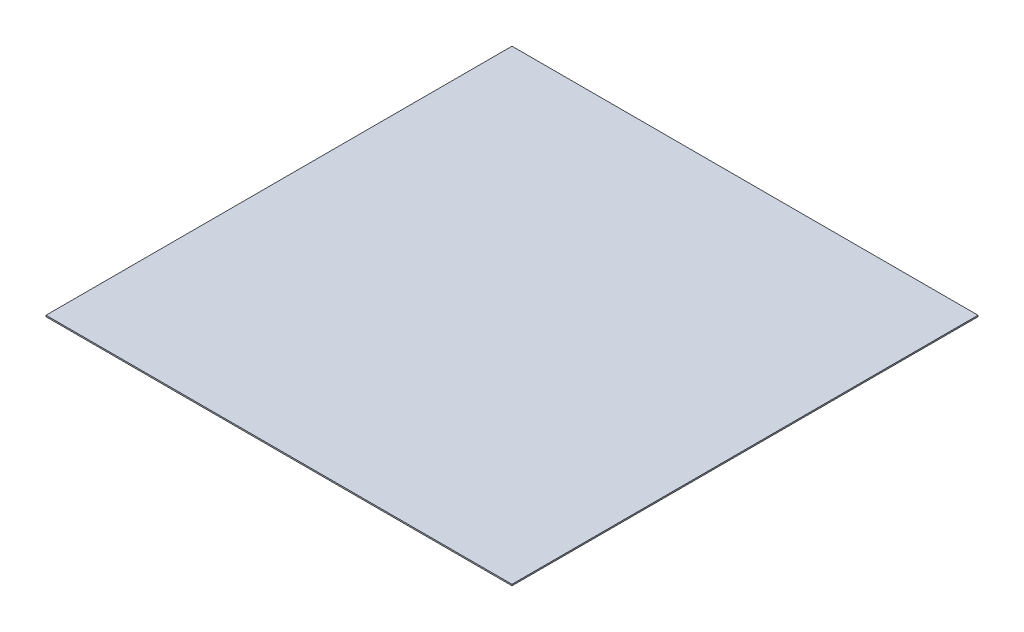
ISO-10303-21;
HEADER;
FILE_DESCRIPTION(('STEP AP214'),'2;1');
FILE_NAME('part.step','',(''),(''),'','','');
FILE_SCHEMA(('AUTOMOTIVE_DESIGN { 1 0 10303 214 1 1 1 1 }'));
ENDSEC;
DATA;
#1=APPLICATION_CONTEXT('core data for automotive mechanical design processes');
#2=APPLICATION_PROTOCOL_DEFINITION('international standard','automotive_design',2000,#1);
#3=PRODUCT_CONTEXT('',#1,'mechanical');
#4=PRODUCT('Part','Part','',(#3));
#5=PRODUCT_RELATED_PRODUCT_CATEGORY('part','',(#4));
#6=PRODUCT_DEFINITION_FORMATION('','',#4);
#7=PRODUCT_DEFINITION_CONTEXT('part definition',#1,'design');
#8=PRODUCT_DEFINITION('design','',#6,#7);
#9=PRODUCT_DEFINITION_SHAPE('','',#8);
#10=(LENGTH_UNIT() NAMED_UNIT(*) SI_UNIT(.MILLI.,.METRE.));
#11=(NAMED_UNIT(*) PLANE_ANGLE_UNIT() SI_UNIT($,.RADIAN.));
#12=(NAMED_UNIT(*) SI_UNIT($,.STERADIAN.) SOLID_ANGLE_UNIT());
#13=UNCERTAINTY_MEASURE_WITH_UNIT(LENGTH_MEASURE(1.E-05),#10,'distance_accuracy_value','');
#14=(GEOMETRIC_REPRESENTATION_CONTEXT(3) GLOBAL_UNCERTAINTY_ASSIGNED_CONTEXT((#13)) GLOBAL_UNIT_ASSIGNED_CONTEXT((#10,
#11,#12)) REPRESENTATION_CONTEXT('',''));
#15=CARTESIAN_POINT('',(0.,0.,0.));
#16=DIRECTION('',(0.,0.,1.));
#17=DIRECTION('',(1.,0.,0.));
#18=AXIS2_PLACEMENT_3D('',#15,#16,#17);
#19=CARTESIAN_POINT('',(0.,1.,345.));
#20=DIRECTION('',(0.,0.,-1.));
#21=DIRECTION('',(-1.,0.,0.));
#22=AXIS2_PLACEMENT_3D('',#19,#20,#21);
#23=PLANE('',#22);
#24=DIRECTION('',(1.,0.,0.));
#25=VECTOR('',#24,1.);
#26=CARTESIAN_POINT('',(0.,0.,345.));
#27=LINE('',#26,#25);
#28=CARTESIAN_POINT('',(0.,0.,345.));
#29=VERTEX_POINT('',#28);
#30=CARTESIAN_POINT('',(345.,0.,345.));
#31=VERTEX_POINT('',#30);
#32=EDGE_CURVE('E101',#29,#31,#27,.T.);
#33=ORIENTED_EDGE('',*,*,#32,.T.);
#34=DIRECTION('',(0.,-1.,0.));
#35=VECTOR('',#34,1.);
#36=CARTESIAN_POINT('',(345.,1.,345.));
#37=LINE('',#36,#35);
#38=CARTESIAN_POINT('',(345.,1.,345.));
#39=VERTEX_POINT('',#38);
#40=EDGE_CURVE('E11',#39,#31,#37,.T.);
#41=ORIENTED_EDGE('',*,*,#40,.F.);
#42=DIRECTION('',(1.,0.,0.));
#43=VECTOR('',#42,1.);
#44=CARTESIAN_POINT('',(0.,1.,345.));
#45=LINE('',#44,#43);
#46=CARTESIAN_POINT('',(0.,1.,345.));
#47=VERTEX_POINT('',#46);
#48=EDGE_CURVE('E78',#47,#39,#45,.T.);
#49=ORIENTED_EDGE('',*,*,#48,.F.);
#50=DIRECTION('',(0.,-1.,0.));
#51=VECTOR('',#50,1.);
#52=CARTESIAN_POINT('',(0.,1.,345.));
#53=LINE('',#52,#51);
#54=EDGE_CURVE('E100',#47,#29,#53,.T.);
#55=ORIENTED_EDGE('',*,*,#54,.T.);
#56=EDGE_LOOP('',(#33,#41,#49,#55));
#57=FACE_BOUND('',#56,.T.);
#58=ADVANCED_FACE('F41',(#57),#23,.F.);
#59=CARTESIAN_POINT('',(345.,1.,0.));
#60=DIRECTION('',(1.,0.,0.));
#61=DIRECTION('',(0.,0.,-1.));
#62=AXIS2_PLACEMENT_3D('',#59,#60,#61);
#63=PLANE('',#62);
#64=DIRECTION('',(0.,0.,1.));
#65=VECTOR('',#64,1.);
#66=CARTESIAN_POINT('',(345.,0.,0.));
#67=LINE('',#66,#65);
#68=CARTESIAN_POINT('',(345.,0.,0.));
#69=VERTEX_POINT('',#68);
#70=EDGE_CURVE('E88',#69,#31,#67,.T.);
#71=ORIENTED_EDGE('',*,*,#70,.F.);
#72=DIRECTION('',(0.,-1.,0.));
#73=VECTOR('',#72,1.);
#74=CARTESIAN_POINT('',(345.,1.,0.));
#75=LINE('',#74,#73);
#76=CARTESIAN_POINT('',(345.,1.,0.));
#77=VERTEX_POINT('',#76);
#78=EDGE_CURVE('E47',#77,#69,#75,.T.);
#79=ORIENTED_EDGE('',*,*,#78,.F.);
#80=DIRECTION('',(0.,0.,1.));
#81=VECTOR('',#80,1.);
#82=CARTESIAN_POINT('',(345.,1.,0.));
#83=LINE('',#82,#81);
#84=EDGE_CURVE('E90',#77,#39,#83,.T.);
#85=ORIENTED_EDGE('',*,*,#84,.T.);
#86=ORIENTED_EDGE('',*,*,#40,.T.);
#87=EDGE_LOOP('',(#71,#79,#85,#86));
#88=FACE_BOUND('',#87,.T.);
#89=ADVANCED_FACE('F86',(#88),#63,.T.);
#90=CARTESIAN_POINT('',(0.,1.,0.));
#91=DIRECTION('',(0.,0.,-1.));
#92=DIRECTION('',(-1.,0.,0.));
#93=AXIS2_PLACEMENT_3D('',#90,#91,#92);
#94=PLANE('',#93);
#95=DIRECTION('',(1.,0.,0.));
#96=VECTOR('',#95,1.);
#97=CARTESIAN_POINT('',(0.,0.,0.));
#98=LINE('',#97,#96);
#99=CARTESIAN_POINT('',(0.,0.,0.));
#100=VERTEX_POINT('',#99);
#101=EDGE_CURVE('E110',#100,#69,#98,.T.);
#102=ORIENTED_EDGE('',*,*,#101,.F.);
#103=DIRECTION('',(0.,-1.,0.));
#104=VECTOR('',#103,1.);
#105=CARTESIAN_POINT('',(0.,1.,0.));
#106=LINE('',#105,#104);
#107=CARTESIAN_POINT('',(0.,1.,0.));
#108=VERTEX_POINT('',#107);
#109=EDGE_CURVE('E71',#108,#100,#106,.T.);
#110=ORIENTED_EDGE('',*,*,#109,.F.);
#111=DIRECTION('',(1.,0.,0.));
#112=VECTOR('',#111,1.);
#113=CARTESIAN_POINT('',(0.,1.,0.));
#114=LINE('',#113,#112);
#115=EDGE_CURVE('E92',#108,#77,#114,.T.);
#116=ORIENTED_EDGE('',*,*,#115,.T.);
#117=ORIENTED_EDGE('',*,*,#78,.T.);
#118=EDGE_LOOP('',(#102,#110,#116,#117));
#119=FACE_BOUND('',#118,.T.);
#120=ADVANCED_FACE('F97',(#119),#94,.T.);
#121=CARTESIAN_POINT('',(0.,1.,0.));
#122=DIRECTION('',(1.,0.,0.));
#123=DIRECTION('',(0.,0.,-1.));
#124=AXIS2_PLACEMENT_3D('',#121,#122,#123);
#125=PLANE('',#124);
#126=DIRECTION('',(0.,0.,1.));
#127=VECTOR('',#126,1.);
#128=CARTESIAN_POINT('',(0.,0.,0.));
#129=LINE('',#128,#127);
#130=EDGE_CURVE('E72',#100,#29,#129,.T.);
#131=ORIENTED_EDGE('',*,*,#130,.T.);
#132=ORIENTED_EDGE('',*,*,#54,.F.);
#133=DIRECTION('',(0.,0.,1.));
#134=VECTOR('',#133,1.);
#135=CARTESIAN_POINT('',(0.,1.,0.));
#136=LINE('',#135,#134);
#137=EDGE_CURVE('E60',#108,#47,#136,.T.);
#138=ORIENTED_EDGE('',*,*,#137,.F.);
#139=ORIENTED_EDGE('',*,*,#109,.T.);
#140=EDGE_LOOP('',(#131,#132,#138,#139));
#141=FACE_BOUND('',#140,.T.);
#142=ADVANCED_FACE('F119',(#141),#125,.F.);
#143=CARTESIAN_POINT('',(0.,1.,0.));
#144=DIRECTION('',(0.,-1.,0.));
#145=DIRECTION('',(0.,0.,-1.));
#146=AXIS2_PLACEMENT_3D('',#143,#144,#145);
#147=PLANE('',#146);
#148=ORIENTED_EDGE('',*,*,#48,.T.);
#149=ORIENTED_EDGE('',*,*,#84,.F.);
#150=ORIENTED_EDGE('',*,*,#115,.F.);
#151=ORIENTED_EDGE('',*,*,#137,.T.);
#152=EDGE_LOOP('',(#148,#149,#150,#151));
#153=FACE_BOUND('',#152,.T.);
#154=ADVANCED_FACE('F93',(#153),#147,.F.);
#155=CARTESIAN_POINT('',(0.,0.,0.));
#156=DIRECTION('',(0.,-1.,0.));
#157=DIRECTION('',(0.,0.,-1.));
#158=AXIS2_PLACEMENT_3D('',#155,#156,#157);
#159=PLANE('',#158);
#160=ORIENTED_EDGE('',*,*,#32,.F.);
#161=ORIENTED_EDGE('',*,*,#130,.F.);
#162=ORIENTED_EDGE('',*,*,#101,.T.);
#163=ORIENTED_EDGE('',*,*,#70,.T.);
#164=EDGE_LOOP('',(#160,#161,#162,#163));
#165=FACE_BOUND('',#164,.T.);
#166=ADVANCED_FACE('F112',(#165),#159,.T.);
#167=CLOSED_SHELL('',(#58,#89,#120,#142,#154,#166));
#168=MANIFOLD_SOLID_BREP('B2',#167);
#169=ADVANCED_BREP_SHAPE_REPRESENTATION('',(#18,#168),#14);
#170=SHAPE_DEFINITION_REPRESENTATION(#9,#169);
ENDSEC;
END-ISO-10303-21;
